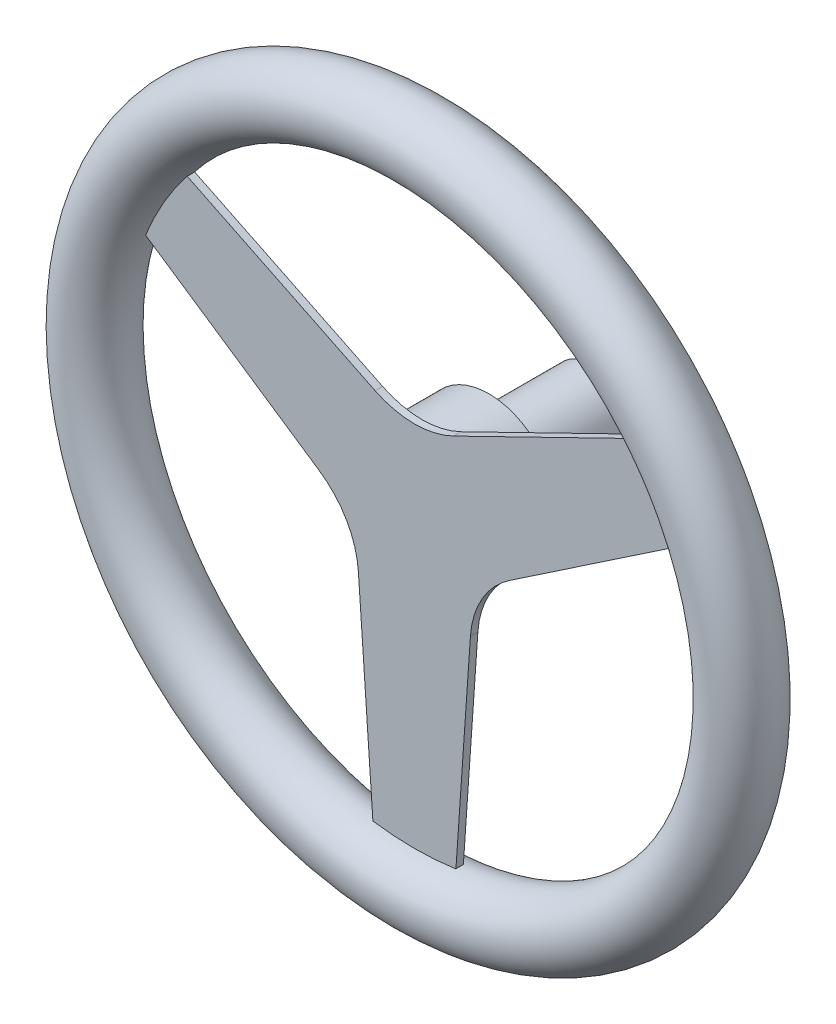
ISO-10303-21;
HEADER;
FILE_DESCRIPTION(('STEP AP214'),'2;1');
FILE_NAME('part.step','',(''),(''),'','','');
FILE_SCHEMA(('AUTOMOTIVE_DESIGN { 1 0 10303 214 1 1 1 1 }'));
ENDSEC;
DATA;
#1=APPLICATION_CONTEXT('core data for automotive mechanical design processes');
#2=APPLICATION_PROTOCOL_DEFINITION('international standard','automotive_design',2000,#1);
#3=PRODUCT_CONTEXT('',#1,'mechanical');
#4=PRODUCT('Part','Part','',(#3));
#5=PRODUCT_RELATED_PRODUCT_CATEGORY('part','',(#4));
#6=PRODUCT_DEFINITION_FORMATION('','',#4);
#7=PRODUCT_DEFINITION_CONTEXT('part definition',#1,'design');
#8=PRODUCT_DEFINITION('design','',#6,#7);
#9=PRODUCT_DEFINITION_SHAPE('','',#8);
#10=(LENGTH_UNIT() NAMED_UNIT(*) SI_UNIT(.MILLI.,.METRE.));
#11=(NAMED_UNIT(*) PLANE_ANGLE_UNIT() SI_UNIT($,.RADIAN.));
#12=(NAMED_UNIT(*) SI_UNIT($,.STERADIAN.) SOLID_ANGLE_UNIT());
#13=UNCERTAINTY_MEASURE_WITH_UNIT(LENGTH_MEASURE(1.E-05),#10,'distance_accuracy_value','');
#14=(GEOMETRIC_REPRESENTATION_CONTEXT(3) GLOBAL_UNCERTAINTY_ASSIGNED_CONTEXT((#13)) GLOBAL_UNIT_ASSIGNED_CONTEXT((#10,
#11,#12)) REPRESENTATION_CONTEXT('',''));
#15=CARTESIAN_POINT('',(0.,0.,0.));
#16=DIRECTION('',(0.,0.,1.));
#17=DIRECTION('',(1.,0.,0.));
#18=AXIS2_PLACEMENT_3D('',#15,#16,#17);
#19=CARTESIAN_POINT('',(-61.8666897828508,-35.71875,1.5875));
#20=DIRECTION('',(0.,0.,-1.));
#21=DIRECTION('',(-1.,0.,0.));
#22=AXIS2_PLACEMENT_3D('',#19,#20,#21);
#23=PLANE('',#22);
#24=CARTESIAN_POINT('',(0.,0.,1.5875));
#25=DIRECTION('',(0.,0.,1.));
#26=DIRECTION('',(1.,0.,0.));
#27=AXIS2_PLACEMENT_3D('',#24,#25,#26);
#28=CIRCLE('',#27,123.276533526229);
#29=CARTESIAN_POINT('',(17.6728575631969,-122.003171367777,1.58750000002132));
#30=VERTEX_POINT('',#29);
#31=CARTESIAN_POINT('',(-17.6728575631968,-122.003171367778,1.58750000002842));
#32=VERTEX_POINT('',#31);
#33=EDGE_CURVE('E61',#30,#32,#28,.F.);
#34=ORIENTED_EDGE('',*,*,#33,.F.);
#35=DIRECTION('',(0.0693903559107038,0.997589584201131,0.));
#36=VECTOR('',#35,1.);
#37=CARTESIAN_POINT('',(16.51,-138.720978586514,1.5875));
#38=LINE('',#37,#36);
#39=CARTESIAN_POINT('',(23.8585266247877,-33.0749774398022,1.5875));
#40=VERTEX_POINT('',#39);
#41=EDGE_CURVE('E274',#30,#40,#38,.T.);
#42=ORIENTED_EDGE('',*,*,#41,.T.);
#43=CARTESIAN_POINT('',(61.8666897828508,-35.71875,1.5875));
#44=DIRECTION('',(0.,0.,1.));
#45=DIRECTION('',(1.,0.,0.));
#46=AXIS2_PLACEMENT_3D('',#43,#44,#45);
#47=CIRCLE('',#46,38.1);
#48=CARTESIAN_POINT('',(40.5730340048597,-4.1246014340325,1.5875));
#49=VERTEX_POINT('',#48);
#50=EDGE_CURVE('E277',#49,#40,#47,.T.);
#51=ORIENTED_EDGE('',*,*,#50,.F.);
#52=DIRECTION('',(0.829242744513583,0.558888603096879,0.));
#53=VECTOR('',#52,1.);
#54=CARTESIAN_POINT('',(40.5730340048597,-4.1246014340325,1.5875));
#55=LINE('',#54,#53);
#56=CARTESIAN_POINT('',(114.494274528357,45.6964420766945,1.5875));
#57=VERTEX_POINT('',#56);
#58=EDGE_CURVE('E281',#49,#57,#55,.T.);
#59=ORIENTED_EDGE('',*,*,#58,.T.);
#60=CARTESIAN_POINT('',(96.8214169651601,76.3067292910796,1.5875));
#61=VERTEX_POINT('',#60);
#62=EDGE_CURVE('E458',#61,#57,#28,.F.);
#63=ORIENTED_EDGE('',*,*,#62,.F.);
#64=DIRECTION('',(-0.898633100424287,-0.438700981104252,0.));
#65=VECTOR('',#64,1.);
#66=CARTESIAN_POINT('',(111.880891493758,83.6585687097379,1.5875));
#67=LINE('',#66,#65);
#68=CARTESIAN_POINT('',(16.714507380072,37.1995788738347,1.5875));
#69=VERTEX_POINT('',#68);
#70=EDGE_CURVE('E285',#61,#69,#67,.T.);
#71=ORIENTED_EDGE('',*,*,#70,.T.);
#72=CARTESIAN_POINT('',(0.,71.4375,1.5875));
#73=DIRECTION('',(0.,0.,1.));
#74=DIRECTION('',(1.,0.,0.));
#75=AXIS2_PLACEMENT_3D('',#72,#73,#74);
#76=CIRCLE('',#75,38.1);
#77=CARTESIAN_POINT('',(-16.714507380072,37.1995788738347,1.5875));
#78=VERTEX_POINT('',#77);
#79=EDGE_CURVE('E288',#78,#69,#76,.T.);
#80=ORIENTED_EDGE('',*,*,#79,.F.);
#81=DIRECTION('',(0.898633100424287,-0.438700981104253,0.));
#82=VECTOR('',#81,1.);
#83=CARTESIAN_POINT('',(-111.880891493758,83.658568709738,1.5875));
#84=LINE('',#83,#82);
#85=CARTESIAN_POINT('',(-96.8214169651601,76.3067292910797,1.5875));
#86=VERTEX_POINT('',#85);
#87=EDGE_CURVE('E292',#86,#78,#84,.T.);
#88=ORIENTED_EDGE('',*,*,#87,.F.);
#89=CARTESIAN_POINT('',(-114.494274528355,45.6964420766928,1.58749999997158));
#90=VERTEX_POINT('',#89);
#91=EDGE_CURVE('E405',#90,#86,#28,.F.);
#92=ORIENTED_EDGE('',*,*,#91,.F.);
#93=DIRECTION('',(0.829242744513583,-0.558888603096879,0.));
#94=VECTOR('',#93,1.);
#95=CARTESIAN_POINT('',(-128.390891493758,55.0624098767758,1.5875));
#96=LINE('',#95,#94);
#97=CARTESIAN_POINT('',(-40.5730340048597,-4.1246014340325,1.5875));
#98=VERTEX_POINT('',#97);
#99=EDGE_CURVE('E263',#90,#98,#96,.T.);
#100=ORIENTED_EDGE('',*,*,#99,.T.);
#101=CARTESIAN_POINT('',(-61.8666897828508,-35.71875,1.5875));
#102=DIRECTION('',(0.,0.,-1.));
#103=DIRECTION('',(-1.,0.,0.));
#104=AXIS2_PLACEMENT_3D('',#101,#102,#103);
#105=CIRCLE('',#104,38.1);
#106=CARTESIAN_POINT('',(-23.8585266247877,-33.0749774398022,1.5875));
#107=VERTEX_POINT('',#106);
#108=EDGE_CURVE('E266',#98,#107,#105,.T.);
#109=ORIENTED_EDGE('',*,*,#108,.T.);
#110=DIRECTION('',(-0.0693903559107039,0.997589584201131,0.));
#111=VECTOR('',#110,1.);
#112=CARTESIAN_POINT('',(-16.51,-138.720978586514,1.5875));
#113=LINE('',#112,#111);
#114=EDGE_CURVE('E271',#32,#107,#113,.T.);
#115=ORIENTED_EDGE('',*,*,#114,.F.);
#116=EDGE_LOOP('',(#34,#42,#51,#59,#63,#71,#80,#88,#92,#100,#109,#115));
#117=FACE_BOUND('',#116,.T.);
#118=ADVANCED_FACE('F45',(#117),#23,.F.);
#119=CARTESIAN_POINT('',(-61.8666897828508,-35.71875,-1.5875));
#120=DIRECTION('',(0.,0.,-1.));
#121=DIRECTION('',(-1.,0.,0.));
#122=AXIS2_PLACEMENT_3D('',#119,#120,#121);
#123=PLANE('',#122);
#124=CARTESIAN_POINT('',(0.,0.,-1.5875));
#125=DIRECTION('',(0.,0.,-1.));
#126=DIRECTION('',(-1.,0.,0.));
#127=AXIS2_PLACEMENT_3D('',#124,#125,#126);
#128=CIRCLE('',#127,28.575);
#129=CARTESIAN_POINT('',(-28.575,0.,-1.5875));
#130=VERTEX_POINT('',#129);
#131=EDGE_CURVE('E253',#130,#130,#128,.T.);
#132=ORIENTED_EDGE('',*,*,#131,.F.);
#133=EDGE_LOOP('',(#132));
#134=FACE_BOUND('',#133,.T.);
#135=DIRECTION('',(0.0693903559107038,0.997589584201131,0.));
#136=VECTOR('',#135,1.);
#137=CARTESIAN_POINT('',(16.51,-138.720978586514,-1.5875));
#138=LINE('',#137,#136);
#139=CARTESIAN_POINT('',(17.672857563197,-122.003171367774,-1.5875));
#140=VERTEX_POINT('',#139);
#141=CARTESIAN_POINT('',(23.8585266247877,-33.0749774398022,-1.5875));
#142=VERTEX_POINT('',#141);
#143=EDGE_CURVE('E305',#140,#142,#138,.T.);
#144=ORIENTED_EDGE('',*,*,#143,.F.);
#145=CARTESIAN_POINT('',(0.,0.,-1.5875));
#146=DIRECTION('',(0.,0.,1.));
#147=DIRECTION('',(1.,0.,0.));
#148=AXIS2_PLACEMENT_3D('',#145,#146,#147);
#149=CIRCLE('',#148,123.276533526229);
#150=CARTESIAN_POINT('',(-17.672857563197,-122.003171367774,-1.5875));
#151=VERTEX_POINT('',#150);
#152=EDGE_CURVE('E352',#140,#151,#149,.F.);
#153=ORIENTED_EDGE('',*,*,#152,.T.);
#154=DIRECTION('',(-0.0693903559107039,0.997589584201131,0.));
#155=VECTOR('',#154,1.);
#156=CARTESIAN_POINT('',(-16.51,-138.720978586514,-1.5875));
#157=LINE('',#156,#155);
#158=CARTESIAN_POINT('',(-23.8585266247877,-33.0749774398022,-1.5875));
#159=VERTEX_POINT('',#158);
#160=EDGE_CURVE('E302',#151,#159,#157,.T.);
#161=ORIENTED_EDGE('',*,*,#160,.T.);
#162=CARTESIAN_POINT('',(-61.8666897828508,-35.71875,-1.5875));
#163=DIRECTION('',(0.,0.,-1.));
#164=DIRECTION('',(-1.,0.,0.));
#165=AXIS2_PLACEMENT_3D('',#162,#163,#164);
#166=CIRCLE('',#165,38.1);
#167=CARTESIAN_POINT('',(-40.5730340048597,-4.1246014340325,-1.5875));
#168=VERTEX_POINT('',#167);
#169=EDGE_CURVE('E298',#168,#159,#166,.T.);
#170=ORIENTED_EDGE('',*,*,#169,.F.);
#171=DIRECTION('',(0.829242744513583,-0.558888603096879,0.));
#172=VECTOR('',#171,1.);
#173=CARTESIAN_POINT('',(-128.390891493758,55.0624098767758,-1.5875));
#174=LINE('',#173,#172);
#175=CARTESIAN_POINT('',(-114.494274528357,45.6964420766946,-1.5875));
#176=VERTEX_POINT('',#175);
#177=EDGE_CURVE('E259',#176,#168,#174,.T.);
#178=ORIENTED_EDGE('',*,*,#177,.F.);
#179=CARTESIAN_POINT('',(-96.8214169651603,76.3067292910798,-1.5875));
#180=VERTEX_POINT('',#179);
#181=EDGE_CURVE('E353',#176,#180,#149,.F.);
#182=ORIENTED_EDGE('',*,*,#181,.T.);
#183=DIRECTION('',(0.898633100424287,-0.438700981104253,0.));
#184=VECTOR('',#183,1.);
#185=CARTESIAN_POINT('',(-111.880891493758,83.658568709738,-1.5875));
#186=LINE('',#185,#184);
#187=CARTESIAN_POINT('',(-16.714507380072,37.1995788738347,-1.5875));
#188=VERTEX_POINT('',#187);
#189=EDGE_CURVE('E267',#180,#188,#186,.T.);
#190=ORIENTED_EDGE('',*,*,#189,.T.);
#191=CARTESIAN_POINT('',(0.,71.4375,-1.5875));
#192=DIRECTION('',(0.,0.,1.));
#193=DIRECTION('',(1.,0.,0.));
#194=AXIS2_PLACEMENT_3D('',#191,#192,#193);
#195=CIRCLE('',#194,38.1);
#196=CARTESIAN_POINT('',(16.714507380072,37.1995788738347,-1.5875));
#197=VERTEX_POINT('',#196);
#198=EDGE_CURVE('E319',#188,#197,#195,.T.);
#199=ORIENTED_EDGE('',*,*,#198,.T.);
#200=DIRECTION('',(-0.898633100424287,-0.438700981104252,0.));
#201=VECTOR('',#200,1.);
#202=CARTESIAN_POINT('',(111.880891493758,83.6585687097379,-1.5875));
#203=LINE('',#202,#201);
#204=CARTESIAN_POINT('',(96.8214169651604,76.3067292910798,-1.5875));
#205=VERTEX_POINT('',#204);
#206=EDGE_CURVE('E316',#205,#197,#203,.T.);
#207=ORIENTED_EDGE('',*,*,#206,.F.);
#208=CARTESIAN_POINT('',(114.494274528357,45.6964420766946,-1.5875));
#209=VERTEX_POINT('',#208);
#210=EDGE_CURVE('E347',#205,#209,#149,.F.);
#211=ORIENTED_EDGE('',*,*,#210,.T.);
#212=DIRECTION('',(0.829242744513583,0.558888603096879,0.));
#213=VECTOR('',#212,1.);
#214=CARTESIAN_POINT('',(40.5730340048597,-4.1246014340325,-1.5875));
#215=LINE('',#214,#213);
#216=CARTESIAN_POINT('',(40.5730340048597,-4.1246014340325,-1.5875));
#217=VERTEX_POINT('',#216);
#218=EDGE_CURVE('E312',#217,#209,#215,.T.);
#219=ORIENTED_EDGE('',*,*,#218,.F.);
#220=CARTESIAN_POINT('',(61.8666897828508,-35.71875,-1.5875));
#221=DIRECTION('',(0.,0.,1.));
#222=DIRECTION('',(1.,0.,0.));
#223=AXIS2_PLACEMENT_3D('',#220,#221,#222);
#224=CIRCLE('',#223,38.1);
#225=EDGE_CURVE('E308',#217,#142,#224,.T.);
#226=ORIENTED_EDGE('',*,*,#225,.T.);
#227=EDGE_LOOP('',(#144,#153,#161,#170,#178,#182,#190,#199,#207,#211,#219,#226));
#228=FACE_BOUND('',#227,.T.);
#229=ADVANCED_FACE('F415',(#134,#228),#123,.T.);
#230=CARTESIAN_POINT('',(-128.390891493758,55.0624098767758,1.5875));
#231=DIRECTION('',(0.558888603096879,0.829242744513583,0.));
#232=DIRECTION('',(-0.829242744513583,0.558888603096879,0.));
#233=AXIS2_PLACEMENT_3D('',#230,#231,#232);
#234=PLANE('',#233);
#235=CARTESIAN_POINT('',(-114.494293084505,45.6964545830683,-1.58769999999997));
#236=CARTESIAN_POINT('',(-114.469796689111,45.6799446331249,-1.32377150360074));
#237=CARTESIAN_POINT('',(-114.451417455686,45.6675574953864,-1.05901803563231));
#238=CARTESIAN_POINT('',(-114.426964115675,45.6510765636805,-0.52950801501417));
#239=CARTESIAN_POINT('',(-114.420852104374,45.646957222896,-0.264754007507084));
#240=CARTESIAN_POINT('',(-114.420852104374,45.646957222896,0.264754007507087));
#241=CARTESIAN_POINT('',(-114.426964115675,45.6510765636805,0.529508015014173));
#242=CARTESIAN_POINT('',(-114.451417455686,45.6675574953864,1.05901803563231));
#243=CARTESIAN_POINT('',(-114.469796689111,45.6799446331249,1.32377150360075));
#244=CARTESIAN_POINT('',(-114.494293084505,45.6964545830683,1.58769999999997));
#245=B_SPLINE_CURVE_WITH_KNOTS('',3,(#235,#236,#237,#238,#239,#240,#241,#242,#243,#244),
.UNSPECIFIED.,.F.,.F.,(4,2,2,2,4),(0.,0.796625382875662,1.59078544530612,2.38494550773657,
3.18157089061223),.UNSPECIFIED.);
#246=EDGE_CURVE('E398',#176,#90,#245,.T.);
#247=ORIENTED_EDGE('',*,*,#246,.F.);
#248=ORIENTED_EDGE('',*,*,#177,.T.);
#249=DIRECTION('',(0.,0.,-1.));
#250=VECTOR('',#249,1.);
#251=CARTESIAN_POINT('',(-40.5730340048597,-4.1246014340325,1.5875));
#252=LINE('',#251,#250);
#253=EDGE_CURVE('E343',#98,#168,#252,.T.);
#254=ORIENTED_EDGE('',*,*,#253,.F.);
#255=ORIENTED_EDGE('',*,*,#99,.F.);
#256=EDGE_LOOP('',(#247,#248,#254,#255));
#257=FACE_BOUND('',#256,.T.);
#258=ADVANCED_FACE('F411',(#257),#234,.F.);
#259=CARTESIAN_POINT('',(-61.8666897828508,-35.71875,1.5875));
#260=DIRECTION('',(0.,0.,-1.));
#261=DIRECTION('',(-1.,0.,0.));
#262=AXIS2_PLACEMENT_3D('',#259,#260,#261);
#263=CYLINDRICAL_SURFACE('',#262,38.1);
#264=ORIENTED_EDGE('',*,*,#169,.T.);
#265=DIRECTION('',(0.,0.,-1.));
#266=VECTOR('',#265,1.);
#267=CARTESIAN_POINT('',(-23.8585266247877,-33.0749774398022,1.5875));
#268=LINE('',#267,#266);
#269=EDGE_CURVE('E339',#107,#159,#268,.T.);
#270=ORIENTED_EDGE('',*,*,#269,.F.);
#271=ORIENTED_EDGE('',*,*,#108,.F.);
#272=ORIENTED_EDGE('',*,*,#253,.T.);
#273=EDGE_LOOP('',(#264,#270,#271,#272));
#274=FACE_BOUND('',#273,.T.);
#275=ADVANCED_FACE('F414',(#274),#263,.F.);
#276=CARTESIAN_POINT('',(-16.51,-138.720978586514,1.5875));
#277=DIRECTION('',(-0.997589584201131,-0.0693903559107039,0.));
#278=DIRECTION('',(0.0693903559107039,-0.997589584201131,0.));
#279=AXIS2_PLACEMENT_3D('',#276,#277,#278);
#280=PLANE('',#279);
#281=ORIENTED_EDGE('',*,*,#160,.F.);
#282=CARTESIAN_POINT('',(-17.6728560104337,-122.003193691057,-1.5877));
#283=CARTESIAN_POINT('',(-17.6749058488027,-121.973724215372,-1.32377150360077));
#284=CARTESIAN_POINT('',(-17.6764438080519,-121.951613763455,-1.05901803563232));
#285=CARTESIAN_POINT('',(-17.6784900435816,-121.922196083945,-0.52950801501418));
#286=CARTESIAN_POINT('',(-17.6790014916977,-121.914843256498,-0.264754007507089));
#287=CARTESIAN_POINT('',(-17.6790014916977,-121.914843256498,0.264754007507092));
#288=CARTESIAN_POINT('',(-17.6784900435816,-121.922196083945,0.529508015014183));
#289=CARTESIAN_POINT('',(-17.6764438080519,-121.951613763455,1.05901803563233));
#290=CARTESIAN_POINT('',(-17.6749058488027,-121.973724215372,1.32377150360077));
#291=CARTESIAN_POINT('',(-17.6728560104337,-122.003193691057,1.5877));
#292=B_SPLINE_CURVE_WITH_KNOTS('',3,(#282,#283,#284,#285,#286,#287,#288,#289,#290,#291),
.UNSPECIFIED.,.F.,.F.,(4,2,2,2,4),(0.,0.796625382875676,1.59078544530614,2.38494550773661,
3.18157089061229),.UNSPECIFIED.);
#293=EDGE_CURVE('E50',#151,#32,#292,.T.);
#294=ORIENTED_EDGE('',*,*,#293,.T.);
#295=ORIENTED_EDGE('',*,*,#114,.T.);
#296=ORIENTED_EDGE('',*,*,#269,.T.);
#297=EDGE_LOOP('',(#281,#294,#295,#296));
#298=FACE_BOUND('',#297,.T.);
#299=ADVANCED_FACE('F387',(#298),#280,.T.);
#300=CARTESIAN_POINT('',(16.51,-138.720978586514,1.5875));
#301=DIRECTION('',(-0.997589584201131,0.0693903559107038,0.));
#302=DIRECTION('',(-0.0693903559107038,-0.997589584201131,0.));
#303=AXIS2_PLACEMENT_3D('',#300,#301,#302);
#304=PLANE('',#303);
#305=CARTESIAN_POINT('',(17.6728560104337,-122.003193691057,-1.5877));
#306=CARTESIAN_POINT('',(17.6749058488027,-121.973724215372,-1.32377150360077));
#307=CARTESIAN_POINT('',(17.6764438080519,-121.951613763455,-1.05901803563232));
#308=CARTESIAN_POINT('',(17.6784900435816,-121.922196083945,-0.52950801501418));
#309=CARTESIAN_POINT('',(17.6790014916977,-121.914843256498,-0.264754007507089));
#310=CARTESIAN_POINT('',(17.6790014916977,-121.914843256498,0.264754007507092));
#311=CARTESIAN_POINT('',(17.6784900435816,-121.922196083945,0.529508015014182));
#312=CARTESIAN_POINT('',(17.6764438080519,-121.951613763455,1.05901803563233));
#313=CARTESIAN_POINT('',(17.6749058488027,-121.973724215372,1.32377150360077));
#314=CARTESIAN_POINT('',(17.6728560104337,-122.003193691057,1.5877));
#315=B_SPLINE_CURVE_WITH_KNOTS('',3,(#305,#306,#307,#308,#309,#310,#311,#312,#313,#314),
.UNSPECIFIED.,.F.,.F.,(4,2,2,2,4),(0.,0.796625382875676,1.59078544530614,2.38494550773661,
3.18157089061229),.UNSPECIFIED.);
#316=EDGE_CURVE('E391',#140,#30,#315,.T.);
#317=ORIENTED_EDGE('',*,*,#316,.F.);
#318=ORIENTED_EDGE('',*,*,#143,.T.);
#319=DIRECTION('',(0.,0.,-1.));
#320=VECTOR('',#319,1.);
#321=CARTESIAN_POINT('',(23.8585266247877,-33.0749774398022,1.5875));
#322=LINE('',#321,#320);
#323=EDGE_CURVE('E335',#40,#142,#322,.T.);
#324=ORIENTED_EDGE('',*,*,#323,.F.);
#325=ORIENTED_EDGE('',*,*,#41,.F.);
#326=EDGE_LOOP('',(#317,#318,#324,#325));
#327=FACE_BOUND('',#326,.T.);
#328=ADVANCED_FACE('F383',(#327),#304,.F.);
#329=CARTESIAN_POINT('',(61.8666897828508,-35.71875,1.5875));
#330=DIRECTION('',(0.,0.,-1.));
#331=DIRECTION('',(-1.,0.,0.));
#332=AXIS2_PLACEMENT_3D('',#329,#330,#331);
#333=CYLINDRICAL_SURFACE('',#332,38.1);
#334=ORIENTED_EDGE('',*,*,#225,.F.);
#335=DIRECTION('',(0.,0.,-1.));
#336=VECTOR('',#335,1.);
#337=CARTESIAN_POINT('',(40.5730340048597,-4.1246014340325,1.5875));
#338=LINE('',#337,#336);
#339=EDGE_CURVE('E332',#49,#217,#338,.T.);
#340=ORIENTED_EDGE('',*,*,#339,.F.);
#341=ORIENTED_EDGE('',*,*,#50,.T.);
#342=ORIENTED_EDGE('',*,*,#323,.T.);
#343=EDGE_LOOP('',(#334,#340,#341,#342));
#344=FACE_BOUND('',#343,.T.);
#345=ADVANCED_FACE('F379',(#344),#333,.F.);
#346=CARTESIAN_POINT('',(40.5730340048597,-4.1246014340325,1.5875));
#347=DIRECTION('',(-0.558888603096879,0.829242744513583,0.));
#348=DIRECTION('',(-0.829242744513583,-0.558888603096879,0.));
#349=AXIS2_PLACEMENT_3D('',#346,#347,#348);
#350=PLANE('',#349);
#351=CARTESIAN_POINT('',(114.494293084505,45.6964545830682,1.58769999999997));
#352=CARTESIAN_POINT('',(114.469796689111,45.6799446331249,1.32377150360074));
#353=CARTESIAN_POINT('',(114.451417455686,45.6675574953863,1.0590180356323));
#354=CARTESIAN_POINT('',(114.426964115675,45.6510765636805,0.52950801501417));
#355=CARTESIAN_POINT('',(114.420852104374,45.6469572228959,0.264754007507085));
#356=CARTESIAN_POINT('',(114.420852104374,45.6469572228959,-0.264754007507085));
#357=CARTESIAN_POINT('',(114.426964115675,45.6510765636805,-0.529508015014169));
#358=CARTESIAN_POINT('',(114.451417455686,45.6675574953863,-1.0590180356323));
#359=CARTESIAN_POINT('',(114.469796689111,45.6799446331249,-1.32377150360074));
#360=CARTESIAN_POINT('',(114.494293084505,45.6964545830682,-1.58769999999997));
#361=B_SPLINE_CURVE_WITH_KNOTS('',3,(#351,#352,#353,#354,#355,#356,#357,#358,#359,#360),
.UNSPECIFIED.,.F.,.F.,(4,2,2,2,4),(0.,0.796625382875662,1.59078544530611,2.38494550773656,
3.18157089061223),.UNSPECIFIED.);
#362=EDGE_CURVE('E361',#57,#209,#361,.T.);
#363=ORIENTED_EDGE('',*,*,#362,.F.);
#364=ORIENTED_EDGE('',*,*,#58,.F.);
#365=ORIENTED_EDGE('',*,*,#339,.T.);
#366=ORIENTED_EDGE('',*,*,#218,.T.);
#367=EDGE_LOOP('',(#363,#364,#365,#366));
#368=FACE_BOUND('',#367,.T.);
#369=ADVANCED_FACE('F373',(#368),#350,.F.);
#370=CARTESIAN_POINT('',(111.880891493758,83.6585687097379,1.5875));
#371=DIRECTION('',(0.438700981104252,-0.898633100424287,0.));
#372=DIRECTION('',(0.898633100424287,0.438700981104252,0.));
#373=AXIS2_PLACEMENT_3D('',#370,#371,#372);
#374=PLANE('',#373);
#375=CARTESIAN_POINT('',(96.8214370740716,76.3067391079884,-1.5877));
#376=CARTESIAN_POINT('',(96.7948908403083,76.2937795822475,-1.32377150360077));
#377=CARTESIAN_POINT('',(96.774973647634,76.2840562680685,-1.05901803563232));
#378=CARTESIAN_POINT('',(96.7484740720931,76.2711195202644,-0.52950801501418));
#379=CARTESIAN_POINT('',(96.7418506126766,76.2678860336024,-0.264754007507091));
#380=CARTESIAN_POINT('',(96.7418506126766,76.2678860336024,0.264754007507088));
#381=CARTESIAN_POINT('',(96.7484740720931,76.2711195202644,0.529508015014177));
#382=CARTESIAN_POINT('',(96.7749736476339,76.2840562680685,1.05901803563232));
#383=CARTESIAN_POINT('',(96.7948908403082,76.2937795822475,1.32377150360076));
#384=CARTESIAN_POINT('',(96.8214370740716,76.3067391079884,1.58769999999999));
#385=B_SPLINE_CURVE_WITH_KNOTS('',3,(#375,#376,#377,#378,#379,#380,#381,#382,#383,#384),
.UNSPECIFIED.,.F.,.F.,(4,2,2,2,4),(0.,0.796625382875676,1.59078544530614,2.3849455077366,
3.18157089061228),.UNSPECIFIED.);
#386=EDGE_CURVE('E351',#205,#61,#385,.T.);
#387=ORIENTED_EDGE('',*,*,#386,.F.);
#388=ORIENTED_EDGE('',*,*,#206,.T.);
#389=DIRECTION('',(0.,0.,-1.));
#390=VECTOR('',#389,1.);
#391=CARTESIAN_POINT('',(16.714507380072,37.1995788738347,1.5875));
#392=LINE('',#391,#390);
#393=EDGE_CURVE('E328',#69,#197,#392,.T.);
#394=ORIENTED_EDGE('',*,*,#393,.F.);
#395=ORIENTED_EDGE('',*,*,#70,.F.);
#396=EDGE_LOOP('',(#387,#388,#394,#395));
#397=FACE_BOUND('',#396,.T.);
#398=ADVANCED_FACE('F368',(#397),#374,.F.);
#399=CARTESIAN_POINT('',(0.,71.4375,1.5875));
#400=DIRECTION('',(0.,0.,-1.));
#401=DIRECTION('',(-1.,0.,0.));
#402=AXIS2_PLACEMENT_3D('',#399,#400,#401);
#403=CYLINDRICAL_SURFACE('',#402,38.1);
#404=ORIENTED_EDGE('',*,*,#198,.F.);
#405=DIRECTION('',(0.,0.,-1.));
#406=VECTOR('',#405,1.);
#407=CARTESIAN_POINT('',(-16.714507380072,37.1995788738347,1.5875));
#408=LINE('',#407,#406);
#409=EDGE_CURVE('E295',#78,#188,#408,.T.);
#410=ORIENTED_EDGE('',*,*,#409,.F.);
#411=ORIENTED_EDGE('',*,*,#79,.T.);
#412=ORIENTED_EDGE('',*,*,#393,.T.);
#413=EDGE_LOOP('',(#404,#410,#411,#412));
#414=FACE_BOUND('',#413,.T.);
#415=ADVANCED_FACE('F372',(#414),#403,.F.);
#416=CARTESIAN_POINT('',(-111.880891493758,83.658568709738,1.5875));
#417=DIRECTION('',(0.438700981104253,0.898633100424287,0.));
#418=DIRECTION('',(-0.898633100424287,0.438700981104253,0.));
#419=AXIS2_PLACEMENT_3D('',#416,#417,#418);
#420=PLANE('',#419);
#421=ORIENTED_EDGE('',*,*,#189,.F.);
#422=CARTESIAN_POINT('',(-96.8214370740716,76.3067391079885,-1.5877));
#423=CARTESIAN_POINT('',(-96.7948908403082,76.2937795822475,-1.32377150360077));
#424=CARTESIAN_POINT('',(-96.7749736476339,76.2840562680685,-1.05901803563233));
#425=CARTESIAN_POINT('',(-96.748474072093,76.2711195202644,-0.529508015014182));
#426=CARTESIAN_POINT('',(-96.7418506126766,76.2678860336024,-0.264754007507092));
#427=CARTESIAN_POINT('',(-96.7418506126766,76.2678860336024,0.264754007507088));
#428=CARTESIAN_POINT('',(-96.748474072093,76.2711195202644,0.529508015014178));
#429=CARTESIAN_POINT('',(-96.7749736476339,76.2840562680685,1.05901803563232));
#430=CARTESIAN_POINT('',(-96.7948908403082,76.2937795822475,1.32377150360077));
#431=CARTESIAN_POINT('',(-96.8214370740715,76.3067391079884,1.5877));
#432=B_SPLINE_CURVE_WITH_KNOTS('',3,(#422,#423,#424,#425,#426,#427,#428,#429,#430,#431),
.UNSPECIFIED.,.F.,.F.,(4,2,2,2,4),(0.,0.796625382875678,1.59078544530614,2.38494550773661,
3.18157089061229),.UNSPECIFIED.);
#433=EDGE_CURVE('E406',#180,#86,#432,.T.);
#434=ORIENTED_EDGE('',*,*,#433,.T.);
#435=ORIENTED_EDGE('',*,*,#87,.T.);
#436=ORIENTED_EDGE('',*,*,#409,.T.);
#437=EDGE_LOOP('',(#421,#434,#435,#436));
#438=FACE_BOUND('',#437,.T.);
#439=ADVANCED_FACE('F434',(#438),#420,.T.);
#440=CARTESIAN_POINT('',(0.,0.,0.));
#441=DIRECTION('',(0.,0.,-1.));
#442=DIRECTION('',(0.,1.,0.));
#443=AXIS2_PLACEMENT_3D('',#440,#441,#442);
#444=TOROIDAL_SURFACE('',#443,137.795,14.605);
#445=ORIENTED_EDGE('',*,*,#386,.T.);
#446=ORIENTED_EDGE('',*,*,#62,.T.);
#447=ORIENTED_EDGE('',*,*,#362,.T.);
#448=ORIENTED_EDGE('',*,*,#210,.F.);
#449=EDGE_LOOP('',(#445,#446,#447,#448));
#450=FACE_BOUND('',#449,.T.);
#451=ORIENTED_EDGE('',*,*,#246,.T.);
#452=ORIENTED_EDGE('',*,*,#91,.T.);
#453=ORIENTED_EDGE('',*,*,#433,.F.);
#454=ORIENTED_EDGE('',*,*,#181,.F.);
#455=EDGE_LOOP('',(#451,#452,#453,#454));
#456=FACE_BOUND('',#455,.T.);
#457=ORIENTED_EDGE('',*,*,#316,.T.);
#458=ORIENTED_EDGE('',*,*,#33,.T.);
#459=ORIENTED_EDGE('',*,*,#293,.F.);
#460=ORIENTED_EDGE('',*,*,#152,.F.);
#461=EDGE_LOOP('',(#457,#458,#459,#460));
#462=FACE_BOUND('',#461,.T.);
#463=ADVANCED_FACE('F47',(#450,#456,#462),#444,.T.);
#464=CARTESIAN_POINT('',(0.,0.,-30.1625));
#465=DIRECTION('',(0.,0.,1.));
#466=DIRECTION('',(1.,0.,0.));
#467=AXIS2_PLACEMENT_3D('',#464,#465,#466);
#468=CYLINDRICAL_SURFACE('',#467,28.575);
#469=CARTESIAN_POINT('',(0.,0.,-30.1625));
#470=DIRECTION('',(0.,0.,-1.));
#471=DIRECTION('',(-1.,0.,0.));
#472=AXIS2_PLACEMENT_3D('',#469,#470,#471);
#473=CIRCLE('',#472,28.575);
#474=CARTESIAN_POINT('',(-28.575,0.,-30.1625));
#475=VERTEX_POINT('',#474);
#476=EDGE_CURVE('E255',#475,#475,#473,.T.);
#477=ORIENTED_EDGE('',*,*,#476,.F.);
#478=EDGE_LOOP('',(#477));
#479=FACE_BOUND('',#478,.T.);
#480=ORIENTED_EDGE('',*,*,#131,.T.);
#481=EDGE_LOOP('',(#480));
#482=FACE_BOUND('',#481,.T.);
#483=ADVANCED_FACE('F432',(#479,#482),#468,.T.);
#484=CARTESIAN_POINT('',(0.,0.,-30.1625));
#485=DIRECTION('',(0.,0.,-1.));
#486=DIRECTION('',(-1.,0.,0.));
#487=AXIS2_PLACEMENT_3D('',#484,#485,#486);
#488=PLANE('',#487);
#489=CARTESIAN_POINT('',(0.,0.,-30.1625));
#490=DIRECTION('',(0.,0.,-1.));
#491=DIRECTION('',(-1.,0.,0.));
#492=AXIS2_PLACEMENT_3D('',#489,#490,#491);
#493=CIRCLE('',#492,17.4625);
#494=CARTESIAN_POINT('',(-17.4625,0.,-30.1625));
#495=VERTEX_POINT('',#494);
#496=EDGE_CURVE('E11',#495,#495,#493,.T.);
#497=ORIENTED_EDGE('',*,*,#496,.F.);
#498=EDGE_LOOP('',(#497));
#499=FACE_BOUND('',#498,.T.);
#500=ORIENTED_EDGE('',*,*,#476,.T.);
#501=EDGE_LOOP('',(#500));
#502=FACE_BOUND('',#501,.T.);
#503=ADVANCED_FACE('F548',(#499,#502),#488,.T.);
#504=CARTESIAN_POINT('',(0.,0.,-73.9775));
#505=DIRECTION('',(0.,0.,1.));
#506=DIRECTION('',(1.,0.,0.));
#507=AXIS2_PLACEMENT_3D('',#504,#505,#506);
#508=CYLINDRICAL_SURFACE('',#507,17.4625);
#509=CARTESIAN_POINT('',(0.,0.,-73.9775));
#510=DIRECTION('',(0.,0.,-1.));
#511=DIRECTION('',(-1.,0.,0.));
#512=AXIS2_PLACEMENT_3D('',#509,#510,#511);
#513=CIRCLE('',#512,17.4625);
#514=CARTESIAN_POINT('',(-17.4625,0.,-73.9775));
#515=VERTEX_POINT('',#514);
#516=EDGE_CURVE('E239',#515,#515,#513,.T.);
#517=ORIENTED_EDGE('',*,*,#516,.F.);
#518=EDGE_LOOP('',(#517));
#519=FACE_BOUND('',#518,.T.);
#520=ORIENTED_EDGE('',*,*,#496,.T.);
#521=EDGE_LOOP('',(#520));
#522=FACE_BOUND('',#521,.T.);
#523=ADVANCED_FACE('F556',(#519,#522),#508,.T.);
#524=CARTESIAN_POINT('',(0.,0.,-73.9775));
#525=DIRECTION('',(0.,0.,-1.));
#526=DIRECTION('',(-1.,0.,0.));
#527=AXIS2_PLACEMENT_3D('',#524,#525,#526);
#528=PLANE('',#527);
#529=DIRECTION('',(-0.866025403784439,0.5,0.));
#530=VECTOR('',#529,1.);
#531=CARTESIAN_POINT('',(0.,-14.6646968374165,-73.9775));
#532=LINE('',#531,#530);
#533=CARTESIAN_POINT('',(0.,-14.6646968374165,-73.9775));
#534=VERTEX_POINT('',#533);
#535=CARTESIAN_POINT('',(-12.7,-7.33234841870825,-73.9775));
#536=VERTEX_POINT('',#535);
#537=EDGE_CURVE('E69',#534,#536,#532,.T.);
#538=ORIENTED_EDGE('',*,*,#537,.F.);
#539=DIRECTION('',(-0.866025403784439,-0.5,0.));
#540=VECTOR('',#539,1.);
#541=CARTESIAN_POINT('',(12.7,-7.33234841870825,-73.9775));
#542=LINE('',#541,#540);
#543=CARTESIAN_POINT('',(12.7,-7.33234841870825,-73.9775));
#544=VERTEX_POINT('',#543);
#545=EDGE_CURVE('E202',#544,#534,#542,.T.);
#546=ORIENTED_EDGE('',*,*,#545,.F.);
#547=DIRECTION('',(0.,-1.,0.));
#548=VECTOR('',#547,1.);
#549=CARTESIAN_POINT('',(12.7,7.33234841870825,-73.9775));
#550=LINE('',#549,#548);
#551=CARTESIAN_POINT('',(12.7,7.33234841870825,-73.9775));
#552=VERTEX_POINT('',#551);
#553=EDGE_CURVE('E206',#552,#544,#550,.T.);
#554=ORIENTED_EDGE('',*,*,#553,.F.);
#555=DIRECTION('',(0.866025403784439,-0.5,0.));
#556=VECTOR('',#555,1.);
#557=CARTESIAN_POINT('',(0.,14.6646968374165,-73.9775));
#558=LINE('',#557,#556);
#559=CARTESIAN_POINT('',(0.,14.6646968374165,-73.9775));
#560=VERTEX_POINT('',#559);
#561=EDGE_CURVE('E229',#560,#552,#558,.T.);
#562=ORIENTED_EDGE('',*,*,#561,.F.);
#563=DIRECTION('',(0.866025403784439,0.5,0.));
#564=VECTOR('',#563,1.);
#565=CARTESIAN_POINT('',(-12.7,7.33234841870826,-73.9775));
#566=LINE('',#565,#564);
#567=CARTESIAN_POINT('',(-12.7,7.33234841870826,-73.9775));
#568=VERTEX_POINT('',#567);
#569=EDGE_CURVE('E225',#568,#560,#566,.T.);
#570=ORIENTED_EDGE('',*,*,#569,.F.);
#571=DIRECTION('',(0.,1.,0.));
#572=VECTOR('',#571,1.);
#573=CARTESIAN_POINT('',(-12.7,-7.33234841870825,-73.9775));
#574=LINE('',#573,#572);
#575=EDGE_CURVE('E222',#536,#568,#574,.T.);
#576=ORIENTED_EDGE('',*,*,#575,.F.);
#577=EDGE_LOOP('',(#538,#546,#554,#562,#570,#576));
#578=FACE_BOUND('',#577,.T.);
#579=ORIENTED_EDGE('',*,*,#516,.T.);
#580=EDGE_LOOP('',(#579));
#581=FACE_BOUND('',#580,.T.);
#582=ADVANCED_FACE('F564',(#578,#581),#528,.T.);
#583=CARTESIAN_POINT('',(0.,-14.6646968374165,-19.3675));
#584=DIRECTION('',(-0.5,-0.866025403784439,0.));
#585=DIRECTION('',(0.866025403784439,-0.5,0.));
#586=AXIS2_PLACEMENT_3D('',#583,#584,#585);
#587=PLANE('',#586);
#588=ORIENTED_EDGE('',*,*,#537,.T.);
#589=DIRECTION('',(0.,0.,-1.));
#590=VECTOR('',#589,1.);
#591=CARTESIAN_POINT('',(-12.7,-7.33234841870825,-19.3675));
#592=LINE('',#591,#590);
#593=CARTESIAN_POINT('',(-12.7,-7.33234841870825,-19.3675));
#594=VERTEX_POINT('',#593);
#595=EDGE_CURVE('E176',#594,#536,#592,.T.);
#596=ORIENTED_EDGE('',*,*,#595,.F.);
#597=DIRECTION('',(-0.866025403784439,0.5,0.));
#598=VECTOR('',#597,1.);
#599=CARTESIAN_POINT('',(0.,-14.6646968374165,-19.3675));
#600=LINE('',#599,#598);
#601=CARTESIAN_POINT('',(0.,-14.6646968374165,-19.3675));
#602=VERTEX_POINT('',#601);
#603=EDGE_CURVE('E180',#602,#594,#600,.T.);
#604=ORIENTED_EDGE('',*,*,#603,.F.);
#605=DIRECTION('',(0.,0.,-1.));
#606=VECTOR('',#605,1.);
#607=CARTESIAN_POINT('',(0.,-14.6646968374165,-19.3675));
#608=LINE('',#607,#606);
#609=EDGE_CURVE('E236',#602,#534,#608,.T.);
#610=ORIENTED_EDGE('',*,*,#609,.T.);
#611=EDGE_LOOP('',(#588,#596,#604,#610));
#612=FACE_BOUND('',#611,.T.);
#613=ADVANCED_FACE('F178',(#612),#587,.F.);
#614=CARTESIAN_POINT('',(12.7,-7.33234841870825,-19.3675));
#615=DIRECTION('',(0.5,-0.866025403784439,0.));
#616=DIRECTION('',(0.866025403784439,0.5,0.));
#617=AXIS2_PLACEMENT_3D('',#614,#615,#616);
#618=PLANE('',#617);
#619=ORIENTED_EDGE('',*,*,#545,.T.);
#620=ORIENTED_EDGE('',*,*,#609,.F.);
#621=DIRECTION('',(-0.866025403784439,-0.5,0.));
#622=VECTOR('',#621,1.);
#623=CARTESIAN_POINT('',(12.7,-7.33234841870825,-19.3675));
#624=LINE('',#623,#622);
#625=CARTESIAN_POINT('',(12.7,-7.33234841870825,-19.3675));
#626=VERTEX_POINT('',#625);
#627=EDGE_CURVE('E187',#626,#602,#624,.T.);
#628=ORIENTED_EDGE('',*,*,#627,.F.);
#629=DIRECTION('',(0.,0.,-1.));
#630=VECTOR('',#629,1.);
#631=CARTESIAN_POINT('',(12.7,-7.33234841870825,-19.3675));
#632=LINE('',#631,#630);
#633=EDGE_CURVE('E240',#626,#544,#632,.T.);
#634=ORIENTED_EDGE('',*,*,#633,.T.);
#635=EDGE_LOOP('',(#619,#620,#628,#634));
#636=FACE_BOUND('',#635,.T.);
#637=ADVANCED_FACE('F581',(#636),#618,.F.);
#638=CARTESIAN_POINT('',(12.7,7.33234841870825,-19.3675));
#639=DIRECTION('',(1.,0.,0.));
#640=DIRECTION('',(0.,0.,-1.));
#641=AXIS2_PLACEMENT_3D('',#638,#639,#640);
#642=PLANE('',#641);
#643=ORIENTED_EDGE('',*,*,#553,.T.);
#644=ORIENTED_EDGE('',*,*,#633,.F.);
#645=DIRECTION('',(0.,-1.,0.));
#646=VECTOR('',#645,1.);
#647=CARTESIAN_POINT('',(12.7,7.33234841870825,-19.3675));
#648=LINE('',#647,#646);
#649=CARTESIAN_POINT('',(12.7,7.33234841870825,-19.3675));
#650=VERTEX_POINT('',#649);
#651=EDGE_CURVE('E215',#650,#626,#648,.T.);
#652=ORIENTED_EDGE('',*,*,#651,.F.);
#653=DIRECTION('',(0.,0.,-1.));
#654=VECTOR('',#653,1.);
#655=CARTESIAN_POINT('',(12.7,7.33234841870825,-19.3675));
#656=LINE('',#655,#654);
#657=EDGE_CURVE('E243',#650,#552,#656,.T.);
#658=ORIENTED_EDGE('',*,*,#657,.T.);
#659=EDGE_LOOP('',(#643,#644,#652,#658));
#660=FACE_BOUND('',#659,.T.);
#661=ADVANCED_FACE('F589',(#660),#642,.F.);
#662=CARTESIAN_POINT('',(0.,14.6646968374165,-19.3675));
#663=DIRECTION('',(0.5,0.866025403784439,0.));
#664=DIRECTION('',(-0.866025403784439,0.5,0.));
#665=AXIS2_PLACEMENT_3D('',#662,#663,#664);
#666=PLANE('',#665);
#667=ORIENTED_EDGE('',*,*,#561,.T.);
#668=ORIENTED_EDGE('',*,*,#657,.F.);
#669=DIRECTION('',(0.866025403784439,-0.5,0.));
#670=VECTOR('',#669,1.);
#671=CARTESIAN_POINT('',(0.,14.6646968374165,-19.3675));
#672=LINE('',#671,#670);
#673=CARTESIAN_POINT('',(0.,14.6646968374165,-19.3675));
#674=VERTEX_POINT('',#673);
#675=EDGE_CURVE('E211',#674,#650,#672,.T.);
#676=ORIENTED_EDGE('',*,*,#675,.F.);
#677=DIRECTION('',(0.,0.,-1.));
#678=VECTOR('',#677,1.);
#679=CARTESIAN_POINT('',(0.,14.6646968374165,-19.3675));
#680=LINE('',#679,#678);
#681=EDGE_CURVE('E246',#674,#560,#680,.T.);
#682=ORIENTED_EDGE('',*,*,#681,.T.);
#683=EDGE_LOOP('',(#667,#668,#676,#682));
#684=FACE_BOUND('',#683,.T.);
#685=ADVANCED_FACE('F598',(#684),#666,.F.);
#686=CARTESIAN_POINT('',(-12.7,7.33234841870826,-19.3675));
#687=DIRECTION('',(-0.5,0.866025403784439,0.));
#688=DIRECTION('',(-0.866025403784439,-0.5,0.));
#689=AXIS2_PLACEMENT_3D('',#686,#687,#688);
#690=PLANE('',#689);
#691=ORIENTED_EDGE('',*,*,#569,.T.);
#692=ORIENTED_EDGE('',*,*,#681,.F.);
#693=DIRECTION('',(0.866025403784439,0.5,0.));
#694=VECTOR('',#693,1.);
#695=CARTESIAN_POINT('',(-12.7,7.33234841870826,-19.3675));
#696=LINE('',#695,#694);
#697=CARTESIAN_POINT('',(-12.7,7.33234841870826,-19.3675));
#698=VERTEX_POINT('',#697);
#699=EDGE_CURVE('E196',#698,#674,#696,.T.);
#700=ORIENTED_EDGE('',*,*,#699,.F.);
#701=DIRECTION('',(0.,0.,-1.));
#702=VECTOR('',#701,1.);
#703=CARTESIAN_POINT('',(-12.7,7.33234841870826,-19.3675));
#704=LINE('',#703,#702);
#705=EDGE_CURVE('E186',#698,#568,#704,.T.);
#706=ORIENTED_EDGE('',*,*,#705,.T.);
#707=EDGE_LOOP('',(#691,#692,#700,#706));
#708=FACE_BOUND('',#707,.T.);
#709=ADVANCED_FACE('F607',(#708),#690,.F.);
#710=CARTESIAN_POINT('',(-12.7,-7.33234841870825,-19.3675));
#711=DIRECTION('',(-1.,0.,0.));
#712=DIRECTION('',(0.,0.,1.));
#713=AXIS2_PLACEMENT_3D('',#710,#711,#712);
#714=PLANE('',#713);
#715=ORIENTED_EDGE('',*,*,#575,.T.);
#716=ORIENTED_EDGE('',*,*,#705,.F.);
#717=DIRECTION('',(0.,1.,0.));
#718=VECTOR('',#717,1.);
#719=CARTESIAN_POINT('',(-12.7,-7.33234841870825,-19.3675));
#720=LINE('',#719,#718);
#721=EDGE_CURVE('E190',#594,#698,#720,.T.);
#722=ORIENTED_EDGE('',*,*,#721,.F.);
#723=ORIENTED_EDGE('',*,*,#595,.T.);
#724=EDGE_LOOP('',(#715,#716,#722,#723));
#725=FACE_BOUND('',#724,.T.);
#726=ADVANCED_FACE('F191',(#725),#714,.F.);
#727=CARTESIAN_POINT('',(0.,0.,-19.3675));
#728=DIRECTION('',(0.,0.,-1.));
#729=DIRECTION('',(-1.,0.,0.));
#730=AXIS2_PLACEMENT_3D('',#727,#728,#729);
#731=PLANE('',#730);
#732=ORIENTED_EDGE('',*,*,#603,.T.);
#733=ORIENTED_EDGE('',*,*,#721,.T.);
#734=ORIENTED_EDGE('',*,*,#699,.T.);
#735=ORIENTED_EDGE('',*,*,#675,.T.);
#736=ORIENTED_EDGE('',*,*,#651,.T.);
#737=ORIENTED_EDGE('',*,*,#627,.T.);
#738=EDGE_LOOP('',(#732,#733,#734,#735,#736,#737));
#739=FACE_BOUND('',#738,.T.);
#740=ADVANCED_FACE('F198',(#739),#731,.T.);
#741=CLOSED_SHELL('',(#118,#229,#258,#275,#299,#328,#345,#369,#398,#415,#439,#463,#483,#503,
#523,#582,#613,#637,#661,#685,#709,#726,#740));
#742=MANIFOLD_SOLID_BREP('B2',#741);
#743=ADVANCED_BREP_SHAPE_REPRESENTATION('',(#18,#742),#14);
#744=SHAPE_DEFINITION_REPRESENTATION(#9,#743);
ENDSEC;
END-ISO-10303-21;
